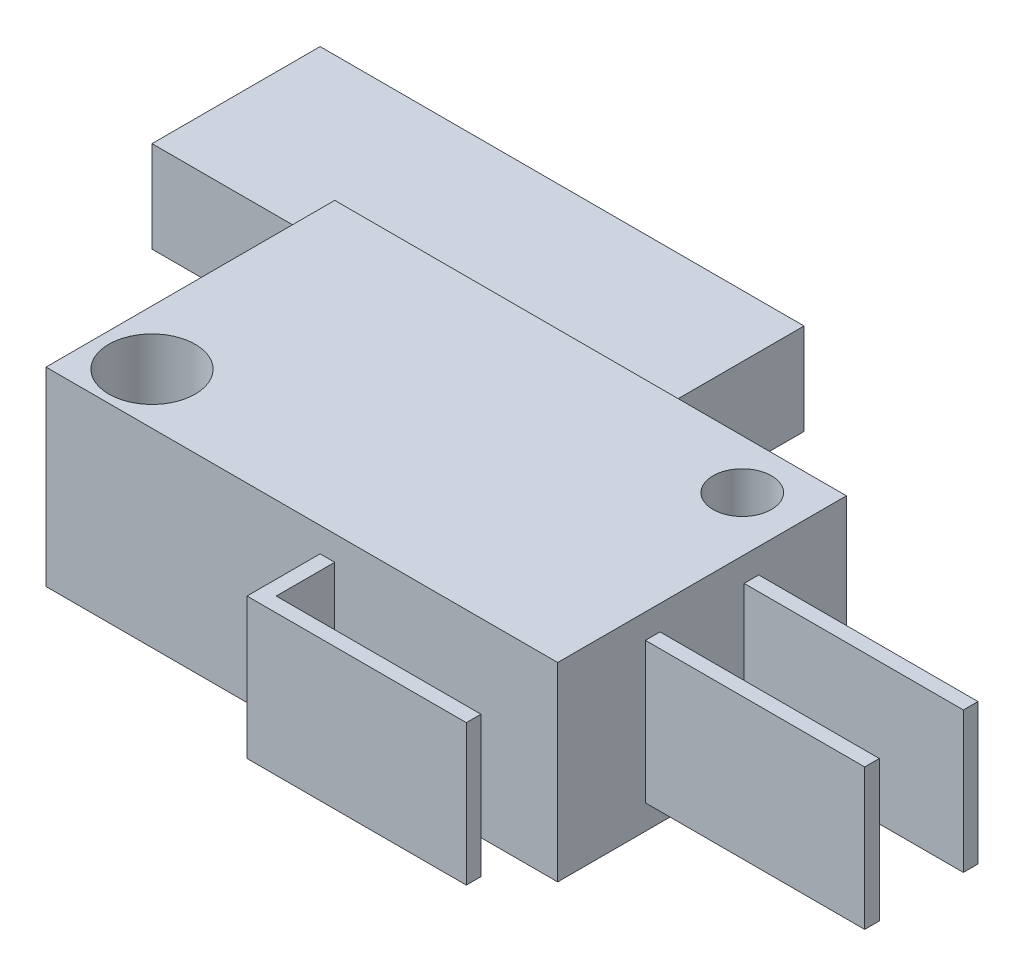
ISO-10303-21;
HEADER;
FILE_DESCRIPTION(('STEP AP214'),'2;1');
FILE_NAME('part.step','',(''),(''),'','','');
FILE_SCHEMA(('AUTOMOTIVE_DESIGN { 1 0 10303 214 1 1 1 1 }'));
ENDSEC;
DATA;
#1=APPLICATION_CONTEXT('core data for automotive mechanical design processes');
#2=APPLICATION_PROTOCOL_DEFINITION('international standard','automotive_design',2000,#1);
#3=PRODUCT_CONTEXT('',#1,'mechanical');
#4=PRODUCT('Part','Part','',(#3));
#5=PRODUCT_RELATED_PRODUCT_CATEGORY('part','',(#4));
#6=PRODUCT_DEFINITION_FORMATION('','',#4);
#7=PRODUCT_DEFINITION_CONTEXT('part definition',#1,'design');
#8=PRODUCT_DEFINITION('design','',#6,#7);
#9=PRODUCT_DEFINITION_SHAPE('','',#8);
#10=(LENGTH_UNIT() NAMED_UNIT(*) SI_UNIT(.MILLI.,.METRE.));
#11=(NAMED_UNIT(*) PLANE_ANGLE_UNIT() SI_UNIT($,.RADIAN.));
#12=(NAMED_UNIT(*) SI_UNIT($,.STERADIAN.) SOLID_ANGLE_UNIT());
#13=UNCERTAINTY_MEASURE_WITH_UNIT(LENGTH_MEASURE(1.E-05),#10,'distance_accuracy_value','');
#14=(GEOMETRIC_REPRESENTATION_CONTEXT(3) GLOBAL_UNCERTAINTY_ASSIGNED_CONTEXT((#13)) GLOBAL_UNIT_ASSIGNED_CONTEXT((#10,
#11,#12)) REPRESENTATION_CONTEXT('',''));
#15=CARTESIAN_POINT('',(0.,0.,0.));
#16=DIRECTION('',(0.,0.,1.));
#17=DIRECTION('',(1.,0.,0.));
#18=AXIS2_PLACEMENT_3D('',#15,#16,#17);
#19=CARTESIAN_POINT('',(0.,10.4,0.));
#20=DIRECTION('',(1.,0.,0.));
#21=DIRECTION('',(0.,0.,-1.));
#22=AXIS2_PLACEMENT_3D('',#19,#20,#21);
#23=PLANE('',#22);
#24=DIRECTION('',(0.,1.,0.));
#25=VECTOR('',#24,1.);
#26=CARTESIAN_POINT('',(0.,8.08913676923808,-15.8));
#27=LINE('',#26,#25);
#28=CARTESIAN_POINT('',(0.,3.08913676923808,-15.8));
#29=VERTEX_POINT('',#28);
#30=CARTESIAN_POINT('',(0.,8.08913676923808,-15.8));
#31=VERTEX_POINT('',#30);
#32=EDGE_CURVE('E58',#29,#31,#27,.T.);
#33=ORIENTED_EDGE('',*,*,#32,.F.);
#34=DIRECTION('',(0.,-1.,0.));
#35=VECTOR('',#34,1.);
#36=CARTESIAN_POINT('',(0.,10.4,-15.8));
#37=LINE('',#36,#35);
#38=CARTESIAN_POINT('',(0.,0.,-15.8));
#39=VERTEX_POINT('',#38);
#40=EDGE_CURVE('E243',#29,#39,#37,.T.);
#41=ORIENTED_EDGE('',*,*,#40,.T.);
#42=DIRECTION('',(0.,0.,1.));
#43=VECTOR('',#42,1.);
#44=CARTESIAN_POINT('',(0.,0.,0.));
#45=LINE('',#44,#43);
#46=CARTESIAN_POINT('',(0.,0.,0.));
#47=VERTEX_POINT('',#46);
#48=EDGE_CURVE('E276',#39,#47,#45,.T.);
#49=ORIENTED_EDGE('',*,*,#48,.T.);
#50=DIRECTION('',(0.,-1.,0.));
#51=VECTOR('',#50,1.);
#52=CARTESIAN_POINT('',(0.,10.4,0.));
#53=LINE('',#52,#51);
#54=CARTESIAN_POINT('',(0.,10.4,0.));
#55=VERTEX_POINT('',#54);
#56=EDGE_CURVE('E11',#55,#47,#53,.T.);
#57=ORIENTED_EDGE('',*,*,#56,.F.);
#58=DIRECTION('',(0.,0.,1.));
#59=VECTOR('',#58,1.);
#60=CARTESIAN_POINT('',(0.,10.4,0.));
#61=LINE('',#60,#59);
#62=CARTESIAN_POINT('',(0.,10.4,-15.8));
#63=VERTEX_POINT('',#62);
#64=EDGE_CURVE('E275',#63,#55,#61,.T.);
#65=ORIENTED_EDGE('',*,*,#64,.F.);
#66=EDGE_CURVE('E247',#63,#31,#37,.T.);
#67=ORIENTED_EDGE('',*,*,#66,.T.);
#68=EDGE_LOOP('',(#33,#41,#49,#57,#65,#67));
#69=FACE_BOUND('',#68,.T.);
#70=ADVANCED_FACE('F34',(#69),#23,.F.);
#71=CARTESIAN_POINT('',(0.,10.4,-15.8));
#72=DIRECTION('',(0.,0.,1.));
#73=DIRECTION('',(1.,0.,0.));
#74=AXIS2_PLACEMENT_3D('',#71,#72,#73);
#75=PLANE('',#74);
#76=DIRECTION('',(-1.,0.,0.));
#77=VECTOR('',#76,1.);
#78=CARTESIAN_POINT('',(0.,3.08913676923808,-15.8));
#79=LINE('',#78,#77);
#80=CARTESIAN_POINT('',(16.4818946153967,3.08913676923808,-15.8));
#81=VERTEX_POINT('',#80);
#82=EDGE_CURVE('E50',#81,#29,#79,.T.);
#83=ORIENTED_EDGE('',*,*,#82,.F.);
#84=DIRECTION('',(0.,-1.,0.));
#85=VECTOR('',#84,1.);
#86=CARTESIAN_POINT('',(16.4818946153967,8.08913676923808,-15.8));
#87=LINE('',#86,#85);
#88=CARTESIAN_POINT('',(16.4818946153967,8.08913676923808,-15.8));
#89=VERTEX_POINT('',#88);
#90=EDGE_CURVE('E235',#89,#81,#87,.T.);
#91=ORIENTED_EDGE('',*,*,#90,.F.);
#92=DIRECTION('',(1.,0.,0.));
#93=VECTOR('',#92,1.);
#94=CARTESIAN_POINT('',(0.,8.08913676923808,-15.8));
#95=LINE('',#94,#93);
#96=EDGE_CURVE('E232',#31,#89,#95,.T.);
#97=ORIENTED_EDGE('',*,*,#96,.F.);
#98=ORIENTED_EDGE('',*,*,#66,.F.);
#99=DIRECTION('',(-1.,0.,0.));
#100=VECTOR('',#99,1.);
#101=CARTESIAN_POINT('',(0.,10.4,-15.8));
#102=LINE('',#101,#100);
#103=CARTESIAN_POINT('',(28.,10.4,-15.8));
#104=VERTEX_POINT('',#103);
#105=EDGE_CURVE('E248',#104,#63,#102,.T.);
#106=ORIENTED_EDGE('',*,*,#105,.F.);
#107=DIRECTION('',(0.,-1.,0.));
#108=VECTOR('',#107,1.);
#109=CARTESIAN_POINT('',(28.,10.4,-15.8));
#110=LINE('',#109,#108);
#111=CARTESIAN_POINT('',(28.,0.,-15.8));
#112=VERTEX_POINT('',#111);
#113=EDGE_CURVE('E254',#104,#112,#110,.T.);
#114=ORIENTED_EDGE('',*,*,#113,.T.);
#115=DIRECTION('',(-1.,0.,0.));
#116=VECTOR('',#115,1.);
#117=CARTESIAN_POINT('',(0.,0.,-15.8));
#118=LINE('',#117,#116);
#119=EDGE_CURVE('E252',#112,#39,#118,.T.);
#120=ORIENTED_EDGE('',*,*,#119,.T.);
#121=ORIENTED_EDGE('',*,*,#40,.F.);
#122=EDGE_LOOP('',(#83,#91,#97,#98,#106,#114,#120,#121));
#123=FACE_BOUND('',#122,.T.);
#124=ADVANCED_FACE('F417',(#123),#75,.F.);
#125=CARTESIAN_POINT('',(0.,10.4,0.));
#126=DIRECTION('',(0.,0.,-1.));
#127=DIRECTION('',(-1.,0.,0.));
#128=AXIS2_PLACEMENT_3D('',#125,#126,#127);
#129=PLANE('',#128);
#130=DIRECTION('',(0.,1.,0.));
#131=VECTOR('',#130,1.);
#132=CARTESIAN_POINT('',(15.8,0.,0.));
#133=LINE('',#132,#131);
#134=CARTESIAN_POINT('',(15.8,1.35,0.));
#135=VERTEX_POINT('',#134);
#136=CARTESIAN_POINT('',(15.8,9.05,0.));
#137=VERTEX_POINT('',#136);
#138=EDGE_CURVE('E388',#135,#137,#133,.T.);
#139=ORIENTED_EDGE('',*,*,#138,.F.);
#140=DIRECTION('',(1.,0.,0.));
#141=VECTOR('',#140,1.);
#142=CARTESIAN_POINT('',(15.,1.35,0.));
#143=LINE('',#142,#141);
#144=CARTESIAN_POINT('',(15.,1.35,0.));
#145=VERTEX_POINT('',#144);
#146=EDGE_CURVE('E369',#145,#135,#143,.T.);
#147=ORIENTED_EDGE('',*,*,#146,.F.);
#148=DIRECTION('',(0.,-1.,0.));
#149=VECTOR('',#148,1.);
#150=CARTESIAN_POINT('',(15.,9.05,0.));
#151=LINE('',#150,#149);
#152=CARTESIAN_POINT('',(15.,9.05,0.));
#153=VERTEX_POINT('',#152);
#154=EDGE_CURVE('E372',#153,#145,#151,.T.);
#155=ORIENTED_EDGE('',*,*,#154,.F.);
#156=DIRECTION('',(-1.,0.,0.));
#157=VECTOR('',#156,1.);
#158=CARTESIAN_POINT('',(15.,9.05,0.));
#159=LINE('',#158,#157);
#160=EDGE_CURVE('E366',#137,#153,#159,.T.);
#161=ORIENTED_EDGE('',*,*,#160,.F.);
#162=EDGE_LOOP('',(#139,#147,#155,#161));
#163=FACE_BOUND('',#162,.T.);
#164=DIRECTION('',(1.,0.,0.));
#165=VECTOR('',#164,1.);
#166=CARTESIAN_POINT('',(0.,0.,0.));
#167=LINE('',#166,#165);
#168=CARTESIAN_POINT('',(28.,0.,0.));
#169=VERTEX_POINT('',#168);
#170=EDGE_CURVE('E273',#47,#169,#167,.T.);
#171=ORIENTED_EDGE('',*,*,#170,.T.);
#172=DIRECTION('',(0.,-1.,0.));
#173=VECTOR('',#172,1.);
#174=CARTESIAN_POINT('',(28.,10.4,0.));
#175=LINE('',#174,#173);
#176=CARTESIAN_POINT('',(28.,10.4,0.));
#177=VERTEX_POINT('',#176);
#178=EDGE_CURVE('E42',#177,#169,#175,.T.);
#179=ORIENTED_EDGE('',*,*,#178,.F.);
#180=DIRECTION('',(1.,0.,0.));
#181=VECTOR('',#180,1.);
#182=CARTESIAN_POINT('',(0.,10.4,0.));
#183=LINE('',#182,#181);
#184=EDGE_CURVE('E284',#55,#177,#183,.T.);
#185=ORIENTED_EDGE('',*,*,#184,.F.);
#186=ORIENTED_EDGE('',*,*,#56,.T.);
#187=EDGE_LOOP('',(#171,#179,#185,#186));
#188=FACE_BOUND('',#187,.T.);
#189=ADVANCED_FACE('F439',(#163,#188),#129,.F.);
#190=CARTESIAN_POINT('',(28.,10.4,0.));
#191=DIRECTION('',(-1.,0.,0.));
#192=DIRECTION('',(0.,0.,1.));
#193=AXIS2_PLACEMENT_3D('',#190,#191,#192);
#194=PLANE('',#193);
#195=DIRECTION('',(0.,-1.,0.));
#196=VECTOR('',#195,1.);
#197=CARTESIAN_POINT('',(28.,9.05,-4.8));
#198=LINE('',#197,#196);
#199=CARTESIAN_POINT('',(28.,9.05,-4.8));
#200=VERTEX_POINT('',#199);
#201=CARTESIAN_POINT('',(28.,1.35,-4.8));
#202=VERTEX_POINT('',#201);
#203=EDGE_CURVE('E310',#200,#202,#198,.T.);
#204=ORIENTED_EDGE('',*,*,#203,.F.);
#205=DIRECTION('',(0.,0.,1.));
#206=VECTOR('',#205,1.);
#207=CARTESIAN_POINT('',(28.,9.05,-4.8));
#208=LINE('',#207,#206);
#209=CARTESIAN_POINT('',(28.,9.05,-5.6));
#210=VERTEX_POINT('',#209);
#211=EDGE_CURVE('E300',#210,#200,#208,.T.);
#212=ORIENTED_EDGE('',*,*,#211,.F.);
#213=DIRECTION('',(0.,1.,0.));
#214=VECTOR('',#213,1.);
#215=CARTESIAN_POINT('',(28.,9.05,-5.6));
#216=LINE('',#215,#214);
#217=CARTESIAN_POINT('',(28.,1.35,-5.6));
#218=VERTEX_POINT('',#217);
#219=EDGE_CURVE('E304',#218,#210,#216,.T.);
#220=ORIENTED_EDGE('',*,*,#219,.F.);
#221=DIRECTION('',(0.,0.,-1.));
#222=VECTOR('',#221,1.);
#223=CARTESIAN_POINT('',(28.,1.35,-4.8));
#224=LINE('',#223,#222);
#225=EDGE_CURVE('E307',#202,#218,#224,.T.);
#226=ORIENTED_EDGE('',*,*,#225,.F.);
#227=EDGE_LOOP('',(#204,#212,#220,#226));
#228=FACE_BOUND('',#227,.T.);
#229=DIRECTION('',(0.,0.,-1.));
#230=VECTOR('',#229,1.);
#231=CARTESIAN_POINT('',(28.,0.,0.));
#232=LINE('',#231,#230);
#233=EDGE_CURVE('E266',#169,#112,#232,.T.);
#234=ORIENTED_EDGE('',*,*,#233,.T.);
#235=ORIENTED_EDGE('',*,*,#113,.F.);
#236=DIRECTION('',(0.,0.,-1.));
#237=VECTOR('',#236,1.);
#238=CARTESIAN_POINT('',(28.,10.4,0.));
#239=LINE('',#238,#237);
#240=EDGE_CURVE('E267',#177,#104,#239,.T.);
#241=ORIENTED_EDGE('',*,*,#240,.F.);
#242=ORIENTED_EDGE('',*,*,#178,.T.);
#243=EDGE_LOOP('',(#234,#235,#241,#242));
#244=FACE_BOUND('',#243,.T.);
#245=DIRECTION('',(0.,-1.,0.));
#246=VECTOR('',#245,1.);
#247=CARTESIAN_POINT('',(28.,9.05,-10.2));
#248=LINE('',#247,#246);
#249=CARTESIAN_POINT('',(28.,9.05,-10.2));
#250=VERTEX_POINT('',#249);
#251=CARTESIAN_POINT('',(28.,1.35,-10.2));
#252=VERTEX_POINT('',#251);
#253=EDGE_CURVE('E343',#250,#252,#248,.T.);
#254=ORIENTED_EDGE('',*,*,#253,.F.);
#255=DIRECTION('',(0.,0.,1.));
#256=VECTOR('',#255,1.);
#257=CARTESIAN_POINT('',(28.,9.05,-10.2));
#258=LINE('',#257,#256);
#259=CARTESIAN_POINT('',(28.,9.05,-11.));
#260=VERTEX_POINT('',#259);
#261=EDGE_CURVE('E333',#260,#250,#258,.T.);
#262=ORIENTED_EDGE('',*,*,#261,.F.);
#263=DIRECTION('',(0.,1.,0.));
#264=VECTOR('',#263,1.);
#265=CARTESIAN_POINT('',(28.,9.05,-11.));
#266=LINE('',#265,#264);
#267=CARTESIAN_POINT('',(28.,1.35,-11.));
#268=VERTEX_POINT('',#267);
#269=EDGE_CURVE('E337',#268,#260,#266,.T.);
#270=ORIENTED_EDGE('',*,*,#269,.F.);
#271=DIRECTION('',(0.,0.,-1.));
#272=VECTOR('',#271,1.);
#273=CARTESIAN_POINT('',(28.,1.35,-10.2));
#274=LINE('',#273,#272);
#275=EDGE_CURVE('E340',#252,#268,#274,.T.);
#276=ORIENTED_EDGE('',*,*,#275,.F.);
#277=EDGE_LOOP('',(#254,#262,#270,#276));
#278=FACE_BOUND('',#277,.T.);
#279=ADVANCED_FACE('F263',(#228,#244,#278),#194,.F.);
#280=CARTESIAN_POINT('',(0.,10.4,0.));
#281=DIRECTION('',(0.,-1.,0.));
#282=DIRECTION('',(0.,0.,-1.));
#283=AXIS2_PLACEMENT_3D('',#280,#281,#282);
#284=PLANE('',#283);
#285=CARTESIAN_POINT('',(3.,10.4,-2.8));
#286=DIRECTION('',(0.,1.,0.));
#287=DIRECTION('',(0.,0.,1.));
#288=AXIS2_PLACEMENT_3D('',#285,#286,#287);
#289=CIRCLE('',#288,2.36500495258738);
#290=CARTESIAN_POINT('',(3.,10.4,-0.434995047412622));
#291=VERTEX_POINT('',#290);
#292=EDGE_CURVE('E407',#291,#291,#289,.T.);
#293=ORIENTED_EDGE('',*,*,#292,.F.);
#294=EDGE_LOOP('',(#293));
#295=FACE_BOUND('',#294,.T.);
#296=CARTESIAN_POINT('',(25.,10.4,-13.1));
#297=DIRECTION('',(0.,1.,0.));
#298=DIRECTION('',(0.,0.,1.));
#299=AXIS2_PLACEMENT_3D('',#296,#297,#298);
#300=CIRCLE('',#299,1.6);
#301=CARTESIAN_POINT('',(25.,10.4,-11.5));
#302=VERTEX_POINT('',#301);
#303=EDGE_CURVE('E401',#302,#302,#300,.T.);
#304=ORIENTED_EDGE('',*,*,#303,.F.);
#305=EDGE_LOOP('',(#304));
#306=FACE_BOUND('',#305,.T.);
#307=ORIENTED_EDGE('',*,*,#64,.T.);
#308=ORIENTED_EDGE('',*,*,#184,.T.);
#309=ORIENTED_EDGE('',*,*,#240,.T.);
#310=ORIENTED_EDGE('',*,*,#105,.T.);
#311=EDGE_LOOP('',(#307,#308,#309,#310));
#312=FACE_BOUND('',#311,.T.);
#313=ADVANCED_FACE('F449',(#295,#306,#312),#284,.F.);
#314=CARTESIAN_POINT('',(0.,0.,0.));
#315=DIRECTION('',(0.,-1.,0.));
#316=DIRECTION('',(0.,0.,-1.));
#317=AXIS2_PLACEMENT_3D('',#314,#315,#316);
#318=PLANE('',#317);
#319=CARTESIAN_POINT('',(3.,0.,-2.8));
#320=DIRECTION('',(0.,1.,0.));
#321=DIRECTION('',(0.,0.,1.));
#322=AXIS2_PLACEMENT_3D('',#319,#320,#321);
#323=CIRCLE('',#322,2.36500495258738);
#324=CARTESIAN_POINT('',(3.,0.,-0.434995047412622));
#325=VERTEX_POINT('',#324);
#326=EDGE_CURVE('E404',#325,#325,#323,.T.);
#327=ORIENTED_EDGE('',*,*,#326,.T.);
#328=EDGE_LOOP('',(#327));
#329=FACE_BOUND('',#328,.T.);
#330=CARTESIAN_POINT('',(25.,0.,-13.1));
#331=DIRECTION('',(0.,1.,0.));
#332=DIRECTION('',(0.,0.,1.));
#333=AXIS2_PLACEMENT_3D('',#330,#331,#332);
#334=CIRCLE('',#333,1.6);
#335=CARTESIAN_POINT('',(25.,0.,-11.5));
#336=VERTEX_POINT('',#335);
#337=EDGE_CURVE('E400',#336,#336,#334,.T.);
#338=ORIENTED_EDGE('',*,*,#337,.T.);
#339=EDGE_LOOP('',(#338));
#340=FACE_BOUND('',#339,.T.);
#341=ORIENTED_EDGE('',*,*,#48,.F.);
#342=ORIENTED_EDGE('',*,*,#119,.F.);
#343=ORIENTED_EDGE('',*,*,#233,.F.);
#344=ORIENTED_EDGE('',*,*,#170,.F.);
#345=EDGE_LOOP('',(#341,#342,#343,#344));
#346=FACE_BOUND('',#345,.T.);
#347=ADVANCED_FACE('F272',(#329,#340,#346),#318,.T.);
#348=CARTESIAN_POINT('',(40.,9.05,-4.8));
#349=DIRECTION('',(0.,0.,-1.));
#350=DIRECTION('',(-1.,0.,0.));
#351=AXIS2_PLACEMENT_3D('',#348,#349,#350);
#352=PLANE('',#351);
#353=ORIENTED_EDGE('',*,*,#203,.T.);
#354=DIRECTION('',(-1.,0.,0.));
#355=VECTOR('',#354,1.);
#356=CARTESIAN_POINT('',(40.,1.35,-4.8));
#357=LINE('',#356,#355);
#358=CARTESIAN_POINT('',(40.,1.35,-4.8));
#359=VERTEX_POINT('',#358);
#360=EDGE_CURVE('E281',#359,#202,#357,.T.);
#361=ORIENTED_EDGE('',*,*,#360,.F.);
#362=DIRECTION('',(0.,-1.,0.));
#363=VECTOR('',#362,1.);
#364=CARTESIAN_POINT('',(40.,9.05,-4.8));
#365=LINE('',#364,#363);
#366=CARTESIAN_POINT('',(40.,9.05,-4.8));
#367=VERTEX_POINT('',#366);
#368=EDGE_CURVE('E303',#367,#359,#365,.T.);
#369=ORIENTED_EDGE('',*,*,#368,.F.);
#370=DIRECTION('',(-1.,0.,0.));
#371=VECTOR('',#370,1.);
#372=CARTESIAN_POINT('',(40.,9.05,-4.8));
#373=LINE('',#372,#371);
#374=EDGE_CURVE('E296',#367,#200,#373,.T.);
#375=ORIENTED_EDGE('',*,*,#374,.T.);
#376=EDGE_LOOP('',(#353,#361,#369,#375));
#377=FACE_BOUND('',#376,.T.);
#378=ADVANCED_FACE('F463',(#377),#352,.F.);
#379=CARTESIAN_POINT('',(40.,1.35,-4.8));
#380=DIRECTION('',(0.,1.,0.));
#381=DIRECTION('',(0.,0.,1.));
#382=AXIS2_PLACEMENT_3D('',#379,#380,#381);
#383=PLANE('',#382);
#384=ORIENTED_EDGE('',*,*,#225,.T.);
#385=DIRECTION('',(-1.,0.,0.));
#386=VECTOR('',#385,1.);
#387=CARTESIAN_POINT('',(40.,1.35,-5.6));
#388=LINE('',#387,#386);
#389=CARTESIAN_POINT('',(40.,1.35,-5.6));
#390=VERTEX_POINT('',#389);
#391=EDGE_CURVE('E290',#390,#218,#388,.T.);
#392=ORIENTED_EDGE('',*,*,#391,.F.);
#393=DIRECTION('',(0.,0.,-1.));
#394=VECTOR('',#393,1.);
#395=CARTESIAN_POINT('',(40.,1.35,-4.8));
#396=LINE('',#395,#394);
#397=EDGE_CURVE('E317',#359,#390,#396,.T.);
#398=ORIENTED_EDGE('',*,*,#397,.F.);
#399=ORIENTED_EDGE('',*,*,#360,.T.);
#400=EDGE_LOOP('',(#384,#392,#398,#399));
#401=FACE_BOUND('',#400,.T.);
#402=ADVANCED_FACE('F471',(#401),#383,.F.);
#403=CARTESIAN_POINT('',(40.,9.05,-5.6));
#404=DIRECTION('',(0.,0.,1.));
#405=DIRECTION('',(0.,-1.,0.));
#406=AXIS2_PLACEMENT_3D('',#403,#404,#405);
#407=PLANE('',#406);
#408=ORIENTED_EDGE('',*,*,#219,.T.);
#409=DIRECTION('',(-1.,0.,0.));
#410=VECTOR('',#409,1.);
#411=CARTESIAN_POINT('',(40.,9.05,-5.6));
#412=LINE('',#411,#410);
#413=CARTESIAN_POINT('',(40.,9.05,-5.6));
#414=VERTEX_POINT('',#413);
#415=EDGE_CURVE('E293',#414,#210,#412,.T.);
#416=ORIENTED_EDGE('',*,*,#415,.F.);
#417=DIRECTION('',(0.,1.,0.));
#418=VECTOR('',#417,1.);
#419=CARTESIAN_POINT('',(40.,9.05,-5.6));
#420=LINE('',#419,#418);
#421=EDGE_CURVE('E315',#390,#414,#420,.T.);
#422=ORIENTED_EDGE('',*,*,#421,.F.);
#423=ORIENTED_EDGE('',*,*,#391,.T.);
#424=EDGE_LOOP('',(#408,#416,#422,#423));
#425=FACE_BOUND('',#424,.T.);
#426=ADVANCED_FACE('F469',(#425),#407,.F.);
#427=CARTESIAN_POINT('',(40.,9.05,-4.8));
#428=DIRECTION('',(0.,-1.,0.));
#429=DIRECTION('',(0.,0.,-1.));
#430=AXIS2_PLACEMENT_3D('',#427,#428,#429);
#431=PLANE('',#430);
#432=ORIENTED_EDGE('',*,*,#211,.T.);
#433=ORIENTED_EDGE('',*,*,#374,.F.);
#434=DIRECTION('',(0.,0.,1.));
#435=VECTOR('',#434,1.);
#436=CARTESIAN_POINT('',(40.,9.05,-4.8));
#437=LINE('',#436,#435);
#438=EDGE_CURVE('E299',#414,#367,#437,.T.);
#439=ORIENTED_EDGE('',*,*,#438,.F.);
#440=ORIENTED_EDGE('',*,*,#415,.T.);
#441=EDGE_LOOP('',(#432,#433,#439,#440));
#442=FACE_BOUND('',#441,.T.);
#443=ADVANCED_FACE('F459',(#442),#431,.F.);
#444=CARTESIAN_POINT('',(40.,0.,0.));
#445=DIRECTION('',(1.,0.,0.));
#446=DIRECTION('',(0.,0.,-1.));
#447=AXIS2_PLACEMENT_3D('',#444,#445,#446);
#448=PLANE('',#447);
#449=ORIENTED_EDGE('',*,*,#368,.T.);
#450=ORIENTED_EDGE('',*,*,#397,.T.);
#451=ORIENTED_EDGE('',*,*,#421,.T.);
#452=ORIENTED_EDGE('',*,*,#438,.T.);
#453=EDGE_LOOP('',(#449,#450,#451,#452));
#454=FACE_BOUND('',#453,.T.);
#455=ADVANCED_FACE('F465',(#454),#448,.T.);
#456=CARTESIAN_POINT('',(40.,9.05,-10.2));
#457=DIRECTION('',(0.,0.,-1.));
#458=DIRECTION('',(0.,1.,0.));
#459=AXIS2_PLACEMENT_3D('',#456,#457,#458);
#460=PLANE('',#459);
#461=ORIENTED_EDGE('',*,*,#253,.T.);
#462=DIRECTION('',(-1.,0.,0.));
#463=VECTOR('',#462,1.);
#464=CARTESIAN_POINT('',(40.,1.35,-10.2));
#465=LINE('',#464,#463);
#466=CARTESIAN_POINT('',(40.,1.35,-10.2));
#467=VERTEX_POINT('',#466);
#468=EDGE_CURVE('E313',#467,#252,#465,.T.);
#469=ORIENTED_EDGE('',*,*,#468,.F.);
#470=DIRECTION('',(0.,-1.,0.));
#471=VECTOR('',#470,1.);
#472=CARTESIAN_POINT('',(40.,9.05,-10.2));
#473=LINE('',#472,#471);
#474=CARTESIAN_POINT('',(40.,9.05,-10.2));
#475=VERTEX_POINT('',#474);
#476=EDGE_CURVE('E336',#475,#467,#473,.T.);
#477=ORIENTED_EDGE('',*,*,#476,.F.);
#478=DIRECTION('',(-1.,0.,0.));
#479=VECTOR('',#478,1.);
#480=CARTESIAN_POINT('',(40.,9.05,-10.2));
#481=LINE('',#480,#479);
#482=EDGE_CURVE('E329',#475,#250,#481,.T.);
#483=ORIENTED_EDGE('',*,*,#482,.T.);
#484=EDGE_LOOP('',(#461,#469,#477,#483));
#485=FACE_BOUND('',#484,.T.);
#486=ADVANCED_FACE('F485',(#485),#460,.F.);
#487=CARTESIAN_POINT('',(40.,1.35,-10.2));
#488=DIRECTION('',(0.,1.,0.));
#489=DIRECTION('',(0.,0.,1.));
#490=AXIS2_PLACEMENT_3D('',#487,#488,#489);
#491=PLANE('',#490);
#492=ORIENTED_EDGE('',*,*,#275,.T.);
#493=DIRECTION('',(-1.,0.,0.));
#494=VECTOR('',#493,1.);
#495=CARTESIAN_POINT('',(40.,1.35,-11.));
#496=LINE('',#495,#494);
#497=CARTESIAN_POINT('',(40.,1.35,-11.));
#498=VERTEX_POINT('',#497);
#499=EDGE_CURVE('E323',#498,#268,#496,.T.);
#500=ORIENTED_EDGE('',*,*,#499,.F.);
#501=DIRECTION('',(0.,0.,-1.));
#502=VECTOR('',#501,1.);
#503=CARTESIAN_POINT('',(40.,1.35,-10.2));
#504=LINE('',#503,#502);
#505=EDGE_CURVE('E350',#467,#498,#504,.T.);
#506=ORIENTED_EDGE('',*,*,#505,.F.);
#507=ORIENTED_EDGE('',*,*,#468,.T.);
#508=EDGE_LOOP('',(#492,#500,#506,#507));
#509=FACE_BOUND('',#508,.T.);
#510=ADVANCED_FACE('F488',(#509),#491,.F.);
#511=CARTESIAN_POINT('',(40.,9.05,-11.));
#512=DIRECTION('',(0.,0.,1.));
#513=DIRECTION('',(1.,0.,0.));
#514=AXIS2_PLACEMENT_3D('',#511,#512,#513);
#515=PLANE('',#514);
#516=ORIENTED_EDGE('',*,*,#269,.T.);
#517=DIRECTION('',(-1.,0.,0.));
#518=VECTOR('',#517,1.);
#519=CARTESIAN_POINT('',(40.,9.05,-11.));
#520=LINE('',#519,#518);
#521=CARTESIAN_POINT('',(40.,9.05,-11.));
#522=VERTEX_POINT('',#521);
#523=EDGE_CURVE('E326',#522,#260,#520,.T.);
#524=ORIENTED_EDGE('',*,*,#523,.F.);
#525=DIRECTION('',(0.,1.,0.));
#526=VECTOR('',#525,1.);
#527=CARTESIAN_POINT('',(40.,9.05,-11.));
#528=LINE('',#527,#526);
#529=EDGE_CURVE('E348',#498,#522,#528,.T.);
#530=ORIENTED_EDGE('',*,*,#529,.F.);
#531=ORIENTED_EDGE('',*,*,#499,.T.);
#532=EDGE_LOOP('',(#516,#524,#530,#531));
#533=FACE_BOUND('',#532,.T.);
#534=ADVANCED_FACE('F492',(#533),#515,.F.);
#535=CARTESIAN_POINT('',(40.,9.05,-10.2));
#536=DIRECTION('',(0.,-1.,0.));
#537=DIRECTION('',(0.,0.,-1.));
#538=AXIS2_PLACEMENT_3D('',#535,#536,#537);
#539=PLANE('',#538);
#540=ORIENTED_EDGE('',*,*,#261,.T.);
#541=ORIENTED_EDGE('',*,*,#482,.F.);
#542=DIRECTION('',(0.,0.,1.));
#543=VECTOR('',#542,1.);
#544=CARTESIAN_POINT('',(40.,9.05,-10.2));
#545=LINE('',#544,#543);
#546=EDGE_CURVE('E332',#522,#475,#545,.T.);
#547=ORIENTED_EDGE('',*,*,#546,.F.);
#548=ORIENTED_EDGE('',*,*,#523,.T.);
#549=EDGE_LOOP('',(#540,#541,#547,#548));
#550=FACE_BOUND('',#549,.T.);
#551=ADVANCED_FACE('F496',(#550),#539,.F.);
#552=CARTESIAN_POINT('',(40.,0.,0.));
#553=DIRECTION('',(1.,0.,0.));
#554=DIRECTION('',(0.,0.,-1.));
#555=AXIS2_PLACEMENT_3D('',#552,#553,#554);
#556=PLANE('',#555);
#557=ORIENTED_EDGE('',*,*,#476,.T.);
#558=ORIENTED_EDGE('',*,*,#505,.T.);
#559=ORIENTED_EDGE('',*,*,#529,.T.);
#560=ORIENTED_EDGE('',*,*,#546,.T.);
#561=EDGE_LOOP('',(#557,#558,#559,#560));
#562=FACE_BOUND('',#561,.T.);
#563=ADVANCED_FACE('F500',(#562),#556,.T.);
#564=CARTESIAN_POINT('',(15.,9.05,4.));
#565=DIRECTION('',(1.,0.,0.));
#566=DIRECTION('',(0.,0.,-1.));
#567=AXIS2_PLACEMENT_3D('',#564,#565,#566);
#568=PLANE('',#567);
#569=ORIENTED_EDGE('',*,*,#154,.T.);
#570=DIRECTION('',(0.,0.,-1.));
#571=VECTOR('',#570,1.);
#572=CARTESIAN_POINT('',(15.,1.35,4.));
#573=LINE('',#572,#571);
#574=CARTESIAN_POINT('',(15.,1.35,4.));
#575=VERTEX_POINT('',#574);
#576=EDGE_CURVE('E346',#575,#145,#573,.T.);
#577=ORIENTED_EDGE('',*,*,#576,.F.);
#578=DIRECTION('',(0.,-1.,0.));
#579=VECTOR('',#578,1.);
#580=CARTESIAN_POINT('',(15.,9.05,4.));
#581=LINE('',#580,#579);
#582=CARTESIAN_POINT('',(15.,9.05,4.));
#583=VERTEX_POINT('',#582);
#584=EDGE_CURVE('E368',#583,#575,#581,.T.);
#585=ORIENTED_EDGE('',*,*,#584,.F.);
#586=DIRECTION('',(0.,0.,-1.));
#587=VECTOR('',#586,1.);
#588=CARTESIAN_POINT('',(15.,9.05,4.));
#589=LINE('',#588,#587);
#590=EDGE_CURVE('E362',#583,#153,#589,.T.);
#591=ORIENTED_EDGE('',*,*,#590,.T.);
#592=EDGE_LOOP('',(#569,#577,#585,#591));
#593=FACE_BOUND('',#592,.T.);
#594=ADVANCED_FACE('F504',(#593),#568,.F.);
#595=CARTESIAN_POINT('',(15.,1.35,4.));
#596=DIRECTION('',(0.,1.,0.));
#597=DIRECTION('',(0.,0.,1.));
#598=AXIS2_PLACEMENT_3D('',#595,#596,#597);
#599=PLANE('',#598);
#600=ORIENTED_EDGE('',*,*,#146,.T.);
#601=DIRECTION('',(0.,0.,1.));
#602=VECTOR('',#601,1.);
#603=CARTESIAN_POINT('',(15.8,1.35,4.));
#604=LINE('',#603,#602);
#605=CARTESIAN_POINT('',(15.8,1.35,3.2));
#606=VERTEX_POINT('',#605);
#607=EDGE_CURVE('E375',#135,#606,#604,.T.);
#608=ORIENTED_EDGE('',*,*,#607,.T.);
#609=DIRECTION('',(1.,0.,0.));
#610=VECTOR('',#609,1.);
#611=CARTESIAN_POINT('',(15.,1.35,3.2));
#612=LINE('',#611,#610);
#613=CARTESIAN_POINT('',(27.,1.35,3.2));
#614=VERTEX_POINT('',#613);
#615=EDGE_CURVE('E385',#606,#614,#612,.T.);
#616=ORIENTED_EDGE('',*,*,#615,.T.);
#617=DIRECTION('',(0.,0.,-1.));
#618=VECTOR('',#617,1.);
#619=CARTESIAN_POINT('',(27.,1.35,4.));
#620=LINE('',#619,#618);
#621=CARTESIAN_POINT('',(27.,1.35,4.));
#622=VERTEX_POINT('',#621);
#623=EDGE_CURVE('E356',#622,#614,#620,.T.);
#624=ORIENTED_EDGE('',*,*,#623,.F.);
#625=DIRECTION('',(1.,0.,0.));
#626=VECTOR('',#625,1.);
#627=CARTESIAN_POINT('',(15.,1.35,4.));
#628=LINE('',#627,#626);
#629=EDGE_CURVE('E379',#575,#622,#628,.T.);
#630=ORIENTED_EDGE('',*,*,#629,.F.);
#631=ORIENTED_EDGE('',*,*,#576,.T.);
#632=EDGE_LOOP('',(#600,#608,#616,#624,#630,#631));
#633=FACE_BOUND('',#632,.T.);
#634=ADVANCED_FACE('F508',(#633),#599,.F.);
#635=CARTESIAN_POINT('',(27.,9.05,4.));
#636=DIRECTION('',(-1.,0.,0.));
#637=DIRECTION('',(0.,-1.,0.));
#638=AXIS2_PLACEMENT_3D('',#635,#636,#637);
#639=PLANE('',#638);
#640=ORIENTED_EDGE('',*,*,#623,.T.);
#641=DIRECTION('',(0.,1.,0.));
#642=VECTOR('',#641,1.);
#643=CARTESIAN_POINT('',(27.,0.,3.2));
#644=LINE('',#643,#642);
#645=CARTESIAN_POINT('',(27.,9.05,3.2));
#646=VERTEX_POINT('',#645);
#647=EDGE_CURVE('E392',#614,#646,#644,.T.);
#648=ORIENTED_EDGE('',*,*,#647,.T.);
#649=DIRECTION('',(0.,0.,-1.));
#650=VECTOR('',#649,1.);
#651=CARTESIAN_POINT('',(27.,9.05,4.));
#652=LINE('',#651,#650);
#653=CARTESIAN_POINT('',(27.,9.05,4.));
#654=VERTEX_POINT('',#653);
#655=EDGE_CURVE('E359',#654,#646,#652,.T.);
#656=ORIENTED_EDGE('',*,*,#655,.F.);
#657=DIRECTION('',(0.,1.,0.));
#658=VECTOR('',#657,1.);
#659=CARTESIAN_POINT('',(27.,9.05,4.));
#660=LINE('',#659,#658);
#661=EDGE_CURVE('E377',#622,#654,#660,.T.);
#662=ORIENTED_EDGE('',*,*,#661,.F.);
#663=EDGE_LOOP('',(#640,#648,#656,#662));
#664=FACE_BOUND('',#663,.T.);
#665=ADVANCED_FACE('F512',(#664),#639,.F.);
#666=CARTESIAN_POINT('',(15.,9.05,4.));
#667=DIRECTION('',(0.,-1.,0.));
#668=DIRECTION('',(0.,0.,-1.));
#669=AXIS2_PLACEMENT_3D('',#666,#667,#668);
#670=PLANE('',#669);
#671=DIRECTION('',(1.,0.,0.));
#672=VECTOR('',#671,1.);
#673=CARTESIAN_POINT('',(15.8,9.05,3.2));
#674=LINE('',#673,#672);
#675=CARTESIAN_POINT('',(15.8,9.05,3.2));
#676=VERTEX_POINT('',#675);
#677=EDGE_CURVE('E393',#676,#646,#674,.T.);
#678=ORIENTED_EDGE('',*,*,#677,.F.);
#679=DIRECTION('',(0.,0.,1.));
#680=VECTOR('',#679,1.);
#681=CARTESIAN_POINT('',(15.8,9.05,0.));
#682=LINE('',#681,#680);
#683=EDGE_CURVE('E398',#137,#676,#682,.T.);
#684=ORIENTED_EDGE('',*,*,#683,.F.);
#685=ORIENTED_EDGE('',*,*,#160,.T.);
#686=ORIENTED_EDGE('',*,*,#590,.F.);
#687=DIRECTION('',(-1.,0.,0.));
#688=VECTOR('',#687,1.);
#689=CARTESIAN_POINT('',(15.,9.05,4.));
#690=LINE('',#689,#688);
#691=EDGE_CURVE('E365',#654,#583,#690,.T.);
#692=ORIENTED_EDGE('',*,*,#691,.F.);
#693=ORIENTED_EDGE('',*,*,#655,.T.);
#694=EDGE_LOOP('',(#678,#684,#685,#686,#692,#693));
#695=FACE_BOUND('',#694,.T.);
#696=ADVANCED_FACE('F516',(#695),#670,.F.);
#697=CARTESIAN_POINT('',(0.,0.,4.));
#698=DIRECTION('',(0.,0.,1.));
#699=DIRECTION('',(1.,0.,0.));
#700=AXIS2_PLACEMENT_3D('',#697,#698,#699);
#701=PLANE('',#700);
#702=ORIENTED_EDGE('',*,*,#584,.T.);
#703=ORIENTED_EDGE('',*,*,#629,.T.);
#704=ORIENTED_EDGE('',*,*,#661,.T.);
#705=ORIENTED_EDGE('',*,*,#691,.T.);
#706=EDGE_LOOP('',(#702,#703,#704,#705));
#707=FACE_BOUND('',#706,.T.);
#708=ADVANCED_FACE('F520',(#707),#701,.T.);
#709=CARTESIAN_POINT('',(15.8,0.,0.));
#710=DIRECTION('',(-1.,0.,0.));
#711=DIRECTION('',(0.,0.,1.));
#712=AXIS2_PLACEMENT_3D('',#709,#710,#711);
#713=PLANE('',#712);
#714=ORIENTED_EDGE('',*,*,#138,.T.);
#715=ORIENTED_EDGE('',*,*,#683,.T.);
#716=DIRECTION('',(0.,1.,0.));
#717=VECTOR('',#716,1.);
#718=CARTESIAN_POINT('',(15.8,0.,3.2));
#719=LINE('',#718,#717);
#720=EDGE_CURVE('E389',#606,#676,#719,.T.);
#721=ORIENTED_EDGE('',*,*,#720,.F.);
#722=ORIENTED_EDGE('',*,*,#607,.F.);
#723=EDGE_LOOP('',(#714,#715,#721,#722));
#724=FACE_BOUND('',#723,.T.);
#725=ADVANCED_FACE('F524',(#724),#713,.F.);
#726=CARTESIAN_POINT('',(15.8,0.,3.2));
#727=DIRECTION('',(0.,0.,1.));
#728=DIRECTION('',(1.,0.,0.));
#729=AXIS2_PLACEMENT_3D('',#726,#727,#728);
#730=PLANE('',#729);
#731=ORIENTED_EDGE('',*,*,#720,.T.);
#732=ORIENTED_EDGE('',*,*,#677,.T.);
#733=ORIENTED_EDGE('',*,*,#647,.F.);
#734=ORIENTED_EDGE('',*,*,#615,.F.);
#735=EDGE_LOOP('',(#731,#732,#733,#734));
#736=FACE_BOUND('',#735,.T.);
#737=ADVANCED_FACE('F528',(#736),#730,.F.);
#738=CARTESIAN_POINT('',(25.,0.,-13.1));
#739=DIRECTION('',(0.,1.,0.));
#740=DIRECTION('',(0.,0.,1.));
#741=AXIS2_PLACEMENT_3D('',#738,#739,#740);
#742=CYLINDRICAL_SURFACE('',#741,1.6);
#743=ORIENTED_EDGE('',*,*,#337,.F.);
#744=EDGE_LOOP('',(#743));
#745=FACE_BOUND('',#744,.T.);
#746=ORIENTED_EDGE('',*,*,#303,.T.);
#747=EDGE_LOOP('',(#746));
#748=FACE_BOUND('',#747,.T.);
#749=ADVANCED_FACE('F432',(#745,#748),#742,.F.);
#750=CARTESIAN_POINT('',(3.,0.,-2.8));
#751=DIRECTION('',(0.,1.,0.));
#752=DIRECTION('',(0.,0.,1.));
#753=AXIS2_PLACEMENT_3D('',#750,#751,#752);
#754=CYLINDRICAL_SURFACE('',#753,2.36500495258738);
#755=ORIENTED_EDGE('',*,*,#326,.F.);
#756=EDGE_LOOP('',(#755));
#757=FACE_BOUND('',#756,.T.);
#758=ORIENTED_EDGE('',*,*,#292,.T.);
#759=EDGE_LOOP('',(#758));
#760=FACE_BOUND('',#759,.T.);
#761=ADVANCED_FACE('F425',(#757,#760),#754,.F.);
#762=CARTESIAN_POINT('',(0.,8.08913676923808,-25.));
#763=DIRECTION('',(0.,-1.,0.));
#764=DIRECTION('',(1.,0.,0.));
#765=AXIS2_PLACEMENT_3D('',#762,#763,#764);
#766=PLANE('',#765);
#767=ORIENTED_EDGE('',*,*,#96,.T.);
#768=DIRECTION('',(0.,0.,1.));
#769=VECTOR('',#768,1.);
#770=CARTESIAN_POINT('',(16.4818946153967,8.08913676923808,-25.));
#771=LINE('',#770,#769);
#772=CARTESIAN_POINT('',(16.4818946153967,8.08913676923808,-25.));
#773=VERTEX_POINT('',#772);
#774=EDGE_CURVE('E410',#773,#89,#771,.T.);
#775=ORIENTED_EDGE('',*,*,#774,.F.);
#776=DIRECTION('',(1.,0.,0.));
#777=VECTOR('',#776,1.);
#778=CARTESIAN_POINT('',(0.,8.08913676923808,-25.));
#779=LINE('',#778,#777);
#780=CARTESIAN_POINT('',(-10.,8.08913676923808,-25.));
#781=VERTEX_POINT('',#780);
#782=EDGE_CURVE('E223',#781,#773,#779,.T.);
#783=ORIENTED_EDGE('',*,*,#782,.F.);
#784=DIRECTION('',(0.,0.,-1.));
#785=VECTOR('',#784,1.);
#786=CARTESIAN_POINT('',(-10.,8.08913676923808,-25.));
#787=LINE('',#786,#785);
#788=CARTESIAN_POINT('',(-10.,8.08913676923808,-15.8));
#789=VERTEX_POINT('',#788);
#790=EDGE_CURVE('E214',#789,#781,#787,.T.);
#791=ORIENTED_EDGE('',*,*,#790,.F.);
#792=DIRECTION('',(1.,0.,0.));
#793=VECTOR('',#792,1.);
#794=CARTESIAN_POINT('',(-10.,8.08913676923808,-15.8));
#795=LINE('',#794,#793);
#796=EDGE_CURVE('E220',#789,#31,#795,.T.);
#797=ORIENTED_EDGE('',*,*,#796,.T.);
#798=EDGE_LOOP('',(#767,#775,#783,#791,#797));
#799=FACE_BOUND('',#798,.T.);
#800=ADVANCED_FACE('F423',(#799),#766,.F.);
#801=CARTESIAN_POINT('',(16.4818946153967,8.08913676923808,-25.));
#802=DIRECTION('',(-1.,0.,0.));
#803=DIRECTION('',(0.,0.,1.));
#804=AXIS2_PLACEMENT_3D('',#801,#802,#803);
#805=PLANE('',#804);
#806=ORIENTED_EDGE('',*,*,#90,.T.);
#807=DIRECTION('',(0.,0.,1.));
#808=VECTOR('',#807,1.);
#809=CARTESIAN_POINT('',(16.4818946153967,3.08913676923808,-25.));
#810=LINE('',#809,#808);
#811=CARTESIAN_POINT('',(16.4818946153967,3.08913676923808,-25.));
#812=VERTEX_POINT('',#811);
#813=EDGE_CURVE('E200',#812,#81,#810,.T.);
#814=ORIENTED_EDGE('',*,*,#813,.F.);
#815=DIRECTION('',(0.,-1.,0.));
#816=VECTOR('',#815,1.);
#817=CARTESIAN_POINT('',(16.4818946153967,8.08913676923808,-25.));
#818=LINE('',#817,#816);
#819=EDGE_CURVE('E196',#773,#812,#818,.T.);
#820=ORIENTED_EDGE('',*,*,#819,.F.);
#821=ORIENTED_EDGE('',*,*,#774,.T.);
#822=EDGE_LOOP('',(#806,#814,#820,#821));
#823=FACE_BOUND('',#822,.T.);
#824=ADVANCED_FACE('F416',(#823),#805,.F.);
#825=CARTESIAN_POINT('',(0.,3.08913676923808,-25.));
#826=DIRECTION('',(0.,1.,0.));
#827=DIRECTION('',(0.,0.,1.));
#828=AXIS2_PLACEMENT_3D('',#825,#826,#827);
#829=PLANE('',#828);
#830=ORIENTED_EDGE('',*,*,#82,.T.);
#831=DIRECTION('',(1.,0.,0.));
#832=VECTOR('',#831,1.);
#833=CARTESIAN_POINT('',(-10.,3.08913676923808,-15.8));
#834=LINE('',#833,#832);
#835=CARTESIAN_POINT('',(-10.,3.08913676923808,-15.8));
#836=VERTEX_POINT('',#835);
#837=EDGE_CURVE('E206',#836,#29,#834,.T.);
#838=ORIENTED_EDGE('',*,*,#837,.F.);
#839=DIRECTION('',(0.,0.,1.));
#840=VECTOR('',#839,1.);
#841=CARTESIAN_POINT('',(-10.,3.08913676923808,-25.));
#842=LINE('',#841,#840);
#843=CARTESIAN_POINT('',(-10.,3.08913676923808,-25.));
#844=VERTEX_POINT('',#843);
#845=EDGE_CURVE('E203',#844,#836,#842,.T.);
#846=ORIENTED_EDGE('',*,*,#845,.F.);
#847=DIRECTION('',(-1.,0.,0.));
#848=VECTOR('',#847,1.);
#849=CARTESIAN_POINT('',(0.,3.08913676923808,-25.));
#850=LINE('',#849,#848);
#851=EDGE_CURVE('E190',#812,#844,#850,.T.);
#852=ORIENTED_EDGE('',*,*,#851,.F.);
#853=ORIENTED_EDGE('',*,*,#813,.T.);
#854=EDGE_LOOP('',(#830,#838,#846,#852,#853));
#855=FACE_BOUND('',#854,.T.);
#856=ADVANCED_FACE('F204',(#855),#829,.F.);
#857=CARTESIAN_POINT('',(0.,0.,-25.));
#858=DIRECTION('',(0.,0.,1.));
#859=DIRECTION('',(1.,0.,0.));
#860=AXIS2_PLACEMENT_3D('',#857,#858,#859);
#861=PLANE('',#860);
#862=ORIENTED_EDGE('',*,*,#851,.T.);
#863=DIRECTION('',(0.,-1.,0.));
#864=VECTOR('',#863,1.);
#865=CARTESIAN_POINT('',(-10.,8.08913676923808,-25.));
#866=LINE('',#865,#864);
#867=EDGE_CURVE('E194',#781,#844,#866,.T.);
#868=ORIENTED_EDGE('',*,*,#867,.F.);
#869=ORIENTED_EDGE('',*,*,#782,.T.);
#870=ORIENTED_EDGE('',*,*,#819,.T.);
#871=EDGE_LOOP('',(#862,#868,#869,#870));
#872=FACE_BOUND('',#871,.T.);
#873=ADVANCED_FACE('F192',(#872),#861,.F.);
#874=CARTESIAN_POINT('',(-10.,8.08913676923808,-15.8));
#875=DIRECTION('',(0.,0.,-1.));
#876=DIRECTION('',(-1.,0.,0.));
#877=AXIS2_PLACEMENT_3D('',#874,#875,#876);
#878=PLANE('',#877);
#879=ORIENTED_EDGE('',*,*,#32,.T.);
#880=ORIENTED_EDGE('',*,*,#796,.F.);
#881=DIRECTION('',(0.,1.,0.));
#882=VECTOR('',#881,1.);
#883=CARTESIAN_POINT('',(-10.,8.08913676923808,-15.8));
#884=LINE('',#883,#882);
#885=EDGE_CURVE('E209',#836,#789,#884,.T.);
#886=ORIENTED_EDGE('',*,*,#885,.F.);
#887=ORIENTED_EDGE('',*,*,#837,.T.);
#888=EDGE_LOOP('',(#879,#880,#886,#887));
#889=FACE_BOUND('',#888,.T.);
#890=ADVANCED_FACE('F422',(#889),#878,.F.);
#891=CARTESIAN_POINT('',(-10.,0.,0.));
#892=DIRECTION('',(-1.,0.,0.));
#893=DIRECTION('',(0.,0.,1.));
#894=AXIS2_PLACEMENT_3D('',#891,#892,#893);
#895=PLANE('',#894);
#896=ORIENTED_EDGE('',*,*,#867,.T.);
#897=ORIENTED_EDGE('',*,*,#845,.T.);
#898=ORIENTED_EDGE('',*,*,#885,.T.);
#899=ORIENTED_EDGE('',*,*,#790,.T.);
#900=EDGE_LOOP('',(#896,#897,#898,#899));
#901=FACE_BOUND('',#900,.T.);
#902=ADVANCED_FACE('F212',(#901),#895,.T.);
#903=CLOSED_SHELL('',(#70,#124,#189,#279,#313,#347,#378,#402,#426,#443,#455,#486,#510,#534,#551,
#563,#594,#634,#665,#696,#708,#725,#737,#749,#761,#800,#824,#856,#873,#890,#902));
#904=MANIFOLD_SOLID_BREP('B2',#903);
#905=ADVANCED_BREP_SHAPE_REPRESENTATION('',(#18,#904),#14);
#906=SHAPE_DEFINITION_REPRESENTATION(#9,#905);
ENDSEC;
END-ISO-10303-21;
